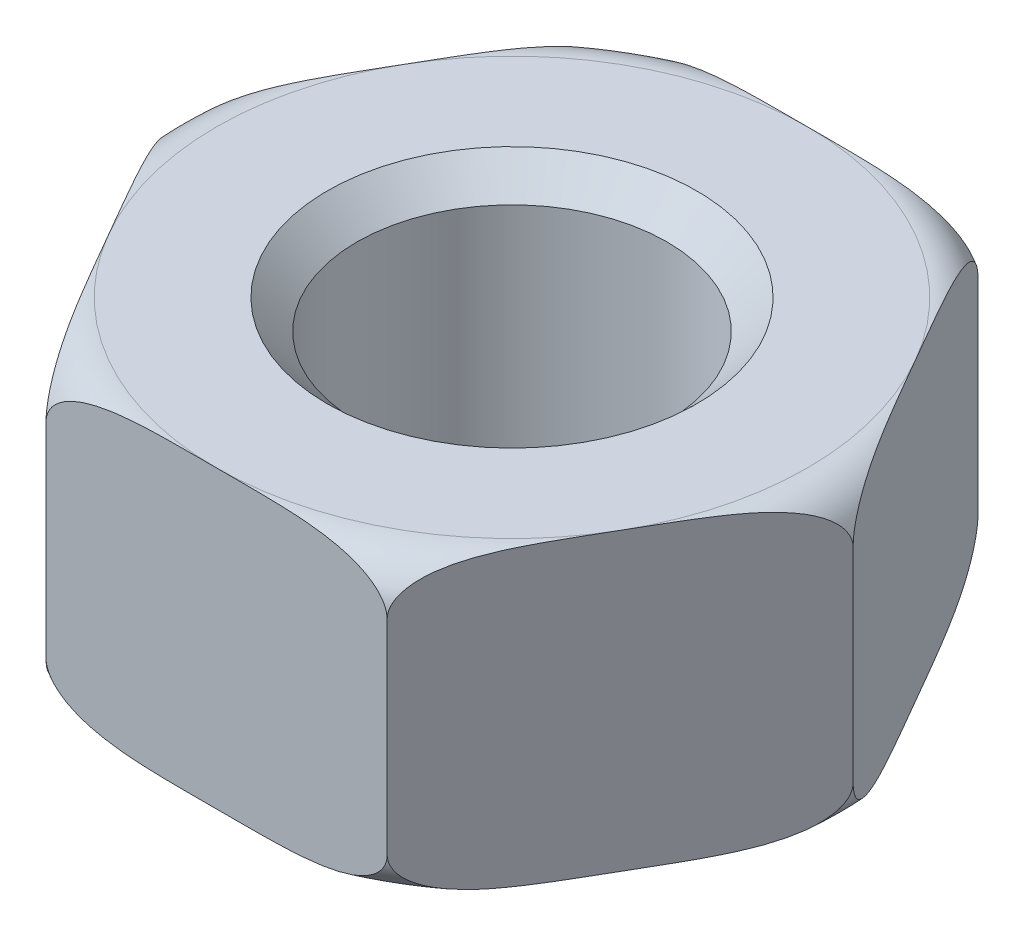
ISO-10303-21;
HEADER;
FILE_DESCRIPTION(('STEP AP214'),'2;1');
FILE_NAME('part.step','',(''),(''),'','','');
FILE_SCHEMA(('AUTOMOTIVE_DESIGN { 1 0 10303 214 1 1 1 1 }'));
ENDSEC;
DATA;
#1=APPLICATION_CONTEXT('core data for automotive mechanical design processes');
#2=APPLICATION_PROTOCOL_DEFINITION('international standard','automotive_design',2000,#1);
#3=PRODUCT_CONTEXT('',#1,'mechanical');
#4=PRODUCT('Part','Part','',(#3));
#5=PRODUCT_RELATED_PRODUCT_CATEGORY('part','',(#4));
#6=PRODUCT_DEFINITION_FORMATION('','',#4);
#7=PRODUCT_DEFINITION_CONTEXT('part definition',#1,'design');
#8=PRODUCT_DEFINITION('design','',#6,#7);
#9=PRODUCT_DEFINITION_SHAPE('','',#8);
#10=(LENGTH_UNIT() NAMED_UNIT(*) SI_UNIT(.MILLI.,.METRE.));
#11=(NAMED_UNIT(*) PLANE_ANGLE_UNIT() SI_UNIT($,.RADIAN.));
#12=(NAMED_UNIT(*) SI_UNIT($,.STERADIAN.) SOLID_ANGLE_UNIT());
#13=UNCERTAINTY_MEASURE_WITH_UNIT(LENGTH_MEASURE(1.E-05),#10,'distance_accuracy_value','');
#14=(GEOMETRIC_REPRESENTATION_CONTEXT(3) GLOBAL_UNCERTAINTY_ASSIGNED_CONTEXT((#13)) GLOBAL_UNIT_ASSIGNED_CONTEXT((#10,
#11,#12)) REPRESENTATION_CONTEXT('',''));
#15=CARTESIAN_POINT('',(0.,0.,0.));
#16=DIRECTION('',(0.,0.,1.));
#17=DIRECTION('',(1.,0.,0.));
#18=AXIS2_PLACEMENT_3D('',#15,#16,#17);
#19=CARTESIAN_POINT('',(0.,1.6,0.));
#20=DIRECTION('',(0.,1.,0.));
#21=DIRECTION('',(0.,0.,1.));
#22=AXIS2_PLACEMENT_3D('',#19,#20,#21);
#23=CONICAL_SURFACE('',#22,2.1,0.785398163397448);
#24=CARTESIAN_POINT('',(0.,1.6,0.));
#25=DIRECTION('',(0.,1.,0.));
#26=DIRECTION('',(0.,0.,1.));
#27=AXIS2_PLACEMENT_3D('',#24,#25,#26);
#28=CIRCLE('',#27,2.1);
#29=CARTESIAN_POINT('',(0.,1.6,2.1));
#30=VERTEX_POINT('',#29);
#31=EDGE_CURVE('E29',#30,#30,#28,.T.);
#32=ORIENTED_EDGE('',*,*,#31,.F.);
#33=EDGE_LOOP('',(#32));
#34=FACE_BOUND('',#33,.T.);
#35=CARTESIAN_POINT('',(0.,2.,0.));
#36=DIRECTION('',(0.,-1.,0.));
#37=DIRECTION('',(0.,0.,1.));
#38=AXIS2_PLACEMENT_3D('',#35,#36,#37);
#39=CIRCLE('',#38,2.5);
#40=CARTESIAN_POINT('',(0.,2.,2.5));
#41=VERTEX_POINT('',#40);
#42=EDGE_CURVE('E981',#41,#41,#39,.T.);
#43=ORIENTED_EDGE('',*,*,#42,.F.);
#44=EDGE_LOOP('',(#43));
#45=FACE_BOUND('',#44,.T.);
#46=ADVANCED_FACE('F15',(#34,#45),#23,.F.);
#47=CARTESIAN_POINT('',(0.,-2.,0.));
#48=DIRECTION('',(0.,-1.,0.));
#49=DIRECTION('',(0.,0.,-1.));
#50=AXIS2_PLACEMENT_3D('',#47,#48,#49);
#51=CONICAL_SURFACE('',#50,2.5,0.785398163397447);
#52=CARTESIAN_POINT('',(0.,-1.6,0.));
#53=DIRECTION('',(0.,-1.,0.));
#54=DIRECTION('',(0.,0.,1.));
#55=AXIS2_PLACEMENT_3D('',#52,#53,#54);
#56=CIRCLE('',#55,2.1);
#57=CARTESIAN_POINT('',(0.,-1.6,2.1));
#58=VERTEX_POINT('',#57);
#59=EDGE_CURVE('E10',#58,#58,#56,.T.);
#60=ORIENTED_EDGE('',*,*,#59,.F.);
#61=EDGE_LOOP('',(#60));
#62=FACE_BOUND('',#61,.T.);
#63=CARTESIAN_POINT('',(0.,-2.,0.));
#64=DIRECTION('',(0.,1.,0.));
#65=DIRECTION('',(0.,0.,1.));
#66=AXIS2_PLACEMENT_3D('',#63,#64,#65);
#67=CIRCLE('',#66,2.5);
#68=CARTESIAN_POINT('',(0.,-2.,2.5));
#69=VERTEX_POINT('',#68);
#70=EDGE_CURVE('E520',#69,#69,#67,.T.);
#71=ORIENTED_EDGE('',*,*,#70,.F.);
#72=EDGE_LOOP('',(#71));
#73=FACE_BOUND('',#72,.T.);
#74=ADVANCED_FACE('F678',(#62,#73),#51,.F.);
#75=CARTESIAN_POINT('',(0.,-2.16286824492314,0.));
#76=DIRECTION('',(0.,1.,0.));
#77=DIRECTION('',(0.,0.,1.));
#78=AXIS2_PLACEMENT_3D('',#75,#76,#77);
#79=CYLINDRICAL_SURFACE('',#78,2.1);
#80=ORIENTED_EDGE('',*,*,#59,.T.);
#81=EDGE_LOOP('',(#80));
#82=FACE_BOUND('',#81,.T.);
#83=ORIENTED_EDGE('',*,*,#31,.T.);
#84=EDGE_LOOP('',(#83));
#85=FACE_BOUND('',#84,.T.);
#86=ADVANCED_FACE('F667',(#82,#85),#79,.F.);
#87=CARTESIAN_POINT('',(0.,-2.,0.));
#88=DIRECTION('',(0.,1.,0.));
#89=DIRECTION('',(1.,0.,0.));
#90=AXIS2_PLACEMENT_3D('',#87,#88,#89);
#91=PLANE('',#90);
#92=ORIENTED_EDGE('',*,*,#70,.T.);
#93=EDGE_LOOP('',(#92));
#94=FACE_BOUND('',#93,.T.);
#95=CARTESIAN_POINT('',(0.,-2.,0.));
#96=DIRECTION('',(0.,1.,0.));
#97=DIRECTION('',(1.,0.,0.));
#98=AXIS2_PLACEMENT_3D('',#95,#96,#97);
#99=CIRCLE('',#98,4.);
#100=CARTESIAN_POINT('',(3.46410161513777,-2.,-2.));
#101=VERTEX_POINT('',#100);
#102=CARTESIAN_POINT('',(0.,-2.,-4.));
#103=VERTEX_POINT('',#102);
#104=EDGE_CURVE('E329',#101,#103,#99,.T.);
#105=ORIENTED_EDGE('',*,*,#104,.F.);
#106=CARTESIAN_POINT('',(0.,-2.,0.));
#107=DIRECTION('',(0.,1.,0.));
#108=DIRECTION('',(1.,0.,0.));
#109=AXIS2_PLACEMENT_3D('',#106,#107,#108);
#110=CIRCLE('',#109,4.);
#111=CARTESIAN_POINT('',(3.46410161513777,-2.,2.));
#112=VERTEX_POINT('',#111);
#113=EDGE_CURVE('E974',#112,#101,#110,.T.);
#114=ORIENTED_EDGE('',*,*,#113,.F.);
#115=CARTESIAN_POINT('',(0.,-2.,0.));
#116=DIRECTION('',(0.,1.,0.));
#117=DIRECTION('',(1.,0.,0.));
#118=AXIS2_PLACEMENT_3D('',#115,#116,#117);
#119=CIRCLE('',#118,4.);
#120=CARTESIAN_POINT('',(0.,-2.,4.));
#121=VERTEX_POINT('',#120);
#122=EDGE_CURVE('E79',#121,#112,#119,.T.);
#123=ORIENTED_EDGE('',*,*,#122,.F.);
#124=CARTESIAN_POINT('',(0.,-2.,0.));
#125=DIRECTION('',(0.,1.,0.));
#126=DIRECTION('',(-1.,0.,0.));
#127=AXIS2_PLACEMENT_3D('',#124,#125,#126);
#128=CIRCLE('',#127,4.);
#129=CARTESIAN_POINT('',(-3.46410161513774,-2.,2.));
#130=VERTEX_POINT('',#129);
#131=EDGE_CURVE('E271',#130,#121,#128,.T.);
#132=ORIENTED_EDGE('',*,*,#131,.F.);
#133=CARTESIAN_POINT('',(0.,-2.,0.));
#134=DIRECTION('',(0.,1.,0.));
#135=DIRECTION('',(1.,0.,0.));
#136=AXIS2_PLACEMENT_3D('',#133,#134,#135);
#137=CIRCLE('',#136,4.);
#138=CARTESIAN_POINT('',(-3.46410161513774,-2.,-2.));
#139=VERTEX_POINT('',#138);
#140=EDGE_CURVE('E374',#139,#130,#137,.T.);
#141=ORIENTED_EDGE('',*,*,#140,.F.);
#142=CARTESIAN_POINT('',(0.,-2.,0.));
#143=DIRECTION('',(0.,1.,0.));
#144=DIRECTION('',(1.,0.,0.));
#145=AXIS2_PLACEMENT_3D('',#142,#143,#144);
#146=CIRCLE('',#145,4.);
#147=EDGE_CURVE('E371',#103,#139,#146,.T.);
#148=ORIENTED_EDGE('',*,*,#147,.F.);
#149=EDGE_LOOP('',(#105,#114,#123,#132,#141,#148));
#150=FACE_BOUND('',#149,.T.);
#151=ADVANCED_FACE('F657',(#94,#150),#91,.F.);
#152=CARTESIAN_POINT('',(0.,-1.38119784648299,0.));
#153=DIRECTION('',(0.,-1.,0.));
#154=DIRECTION('',(-1.,0.,0.));
#155=AXIS2_PLACEMENT_3D('',#152,#153,#154);
#156=TOROIDAL_SURFACE('',#155,4.,0.618802153517015);
#157=ORIENTED_EDGE('',*,*,#104,.T.);
#158=CARTESIAN_POINT('',(2.30940107675853,-1.38119784648298,-4.));
#159=CARTESIAN_POINT('',(2.30940107675853,-1.53311042973439,-4.));
#160=CARTESIAN_POINT('',(2.17058493305778,-1.66286205167738,-4.));
#161=CARTESIAN_POINT('',(2.06734871184109,-1.75935707588009,-4.));
#162=CARTESIAN_POINT('',(1.89699346630574,-1.82903988159357,-4.));
#163=CARTESIAN_POINT('',(1.65387305202242,-1.92848684925366,-4.));
#164=CARTESIAN_POINT('',(1.27412688280946,-1.96745964180882,-4.));
#165=CARTESIAN_POINT('',(1.02594485791631,-1.99293019913433,-4.));
#166=CARTESIAN_POINT('',(0.63718117734921,-1.99794148266363,-4.));
#167=CARTESIAN_POINT('',(0.477486206685755,-2.,-4.));
#168=CARTESIAN_POINT('',(0.,-2.,-4.));
#169=B_SPLINE_CURVE_WITH_KNOTS('',2,(#158,#159,#160,#161,#162,#163,#164,#165,#166,#167,#168),
.UNSPECIFIED.,.F.,.F.,(3,2,2,2,2,3),(0.,0.125,0.25,0.5,0.75,1.),.UNSPECIFIED.);
#170=CARTESIAN_POINT('',(2.30940107675853,-1.38119784648298,-4.));
#171=VERTEX_POINT('',#170);
#172=EDGE_CURVE('E142',#171,#103,#169,.T.);
#173=ORIENTED_EDGE('',*,*,#172,.F.);
#174=CARTESIAN_POINT('',(3.46410161513776,-2.,-2.));
#175=CARTESIAN_POINT('',(3.22474695024369,-2.,-2.41457444062515));
#176=CARTESIAN_POINT('',(3.1442448478216,-1.99790871420006,-2.55400817213633));
#177=CARTESIAN_POINT('',(2.9497853741718,-1.99285704071983,-2.89082186051088));
#178=CARTESIAN_POINT('',(2.82491461005143,-1.96702199911714,-3.1071043683473));
#179=CARTESIAN_POINT('',(2.63605571126172,-1.92794818114508,-3.43421757651259));
#180=CARTESIAN_POINT('',(2.51435100373841,-1.82801221941492,-3.64501631346328));
#181=CARTESIAN_POINT('',(2.43008093731723,-1.75881514146909,-3.79097635006196));
#182=CARTESIAN_POINT('',(2.37830008499461,-1.66190994790941,-3.88066341714396));
#183=CARTESIAN_POINT('',(2.30940107675851,-1.53296900874546,-3.99999999999999));
#184=CARTESIAN_POINT('',(2.30940107675851,-1.38119784648298,-3.99999999999999));
#185=B_SPLINE_CURVE_WITH_KNOTS('',2,(#174,#175,#176,#177,#178,#179,#180,#181,#182,#183,#184),
.UNSPECIFIED.,.F.,.F.,(3,2,2,2,2,3),(0.,0.25,0.5,0.75,0.875,1.),.UNSPECIFIED.);
#186=EDGE_CURVE('E1193',#101,#171,#185,.T.);
#187=ORIENTED_EDGE('',*,*,#186,.F.);
#188=EDGE_LOOP('',(#157,#173,#187));
#189=FACE_BOUND('',#188,.T.);
#190=ADVANCED_FACE('F246',(#189),#156,.T.);
#191=CARTESIAN_POINT('',(0.,-1.38119784648299,0.));
#192=DIRECTION('',(0.,-1.,0.));
#193=DIRECTION('',(-1.,0.,0.));
#194=AXIS2_PLACEMENT_3D('',#191,#192,#193);
#195=TOROIDAL_SURFACE('',#194,4.,0.618802153517015);
#196=ORIENTED_EDGE('',*,*,#147,.T.);
#197=CARTESIAN_POINT('',(-2.3094010767585,-1.38119784648298,-4.00000000000002));
#198=CARTESIAN_POINT('',(-2.3094010767585,-1.45868796626602,-4.00000000000002));
#199=CARTESIAN_POINT('',(-2.32947067101236,-1.53563413097515,-3.96523844306502));
#200=CARTESIAN_POINT('',(-2.34731691692672,-1.60405605122902,-3.93432783841699));
#201=CARTESIAN_POINT('',(-2.37893859251022,-1.66310345008823,-3.87955748968592));
#202=CARTESIAN_POINT('',(-2.43055561551908,-1.75948831551009,-3.79015418329911));
#203=CARTESIAN_POINT('',(-2.51566950292517,-1.82909268029787,-3.64273260588206));
#204=CARTESIAN_POINT('',(-2.63693612038259,-1.92826199491058,-3.4326926631838));
#205=CARTESIAN_POINT('',(-2.8261115223567,-1.96726922171706,-3.10503125542238));
#206=CARTESIAN_POINT('',(-2.95027605576066,-1.99287146209963,-2.88997197506863));
#207=CARTESIAN_POINT('',(-3.14471756697839,-1.99792099334568,-2.55318939853906));
#208=CARTESIAN_POINT('',(-3.2247735515838,-2.,-2.41452836575253));
#209=CARTESIAN_POINT('',(-3.46410161513776,-2.,-2.));
#210=B_SPLINE_CURVE_WITH_KNOTS('',2,(#197,#198,#199,#200,#201,#202,#203,#204,#205,#206,#207,
#208,#209),.UNSPECIFIED.,.F.,.F.,(3,2,2,2,2,2,3),(0.,0.0625,0.125,0.25,0.5,0.75,1.),.UNSPECIFIED.);
#211=CARTESIAN_POINT('',(-2.30940107675849,-1.38119784648298,-4.));
#212=VERTEX_POINT('',#211);
#213=EDGE_CURVE('E356',#212,#139,#210,.T.);
#214=ORIENTED_EDGE('',*,*,#213,.F.);
#215=CARTESIAN_POINT('',(0.,-2.,-4.));
#216=CARTESIAN_POINT('',(-0.477678904070755,-2.,-4.));
#217=CARTESIAN_POINT('',(-0.6383440358329,-1.99792648340885,-4.));
#218=CARTESIAN_POINT('',(-1.02721740774398,-1.99290775047237,-4.));
#219=CARTESIAN_POINT('',(-1.27685049433859,-1.96717950580727,-4.));
#220=CARTESIAN_POINT('',(-1.6550587084658,-1.92819976317715,-4.));
#221=CARTESIAN_POINT('',(-1.89878095140311,-1.82830800187989,-4.));
#222=CARTESIAN_POINT('',(-2.06786482549243,-1.75900744979984,-4.));
#223=CARTESIAN_POINT('',(-2.17167839650144,-1.66183932160722,-4.));
#224=CARTESIAN_POINT('',(-2.30940107675849,-1.53293271604324,-4.));
#225=CARTESIAN_POINT('',(-2.30940107675849,-1.38119784648298,-4.));
#226=B_SPLINE_CURVE_WITH_KNOTS('',2,(#215,#216,#217,#218,#219,#220,#221,#222,#223,#224,#225),
.UNSPECIFIED.,.F.,.F.,(3,2,2,2,2,3),(0.,0.25,0.5,0.75,0.875,1.),.UNSPECIFIED.);
#227=EDGE_CURVE('E324',#103,#212,#226,.T.);
#228=ORIENTED_EDGE('',*,*,#227,.F.);
#229=EDGE_LOOP('',(#196,#214,#228));
#230=FACE_BOUND('',#229,.T.);
#231=ADVANCED_FACE('F331',(#230),#195,.T.);
#232=CARTESIAN_POINT('',(0.,-1.38119784648299,0.));
#233=DIRECTION('',(0.,-1.,0.));
#234=DIRECTION('',(-1.,0.,0.));
#235=AXIS2_PLACEMENT_3D('',#232,#233,#234);
#236=TOROIDAL_SURFACE('',#235,4.,0.618802153517015);
#237=ORIENTED_EDGE('',*,*,#140,.T.);
#238=CARTESIAN_POINT('',(-4.61880215351701,-1.38119784648298,0.));
#239=CARTESIAN_POINT('',(-4.61880215351701,-1.45868796626602,0.));
#240=CARTESIAN_POINT('',(-4.59873255926315,-1.53563413097515,0.0347615569349823));
#241=CARTESIAN_POINT('',(-4.58088631334883,-1.6040560512289,0.0656721615829534));
#242=CARTESIAN_POINT('',(-4.54926463776529,-1.66310345008823,0.12044251031409));
#243=CARTESIAN_POINT('',(-4.49764761475657,-1.75948831550994,0.209845816700658));
#244=CARTESIAN_POINT('',(-4.41253372735034,-1.82909268029787,0.357267394117946));
#245=CARTESIAN_POINT('',(-4.29126710989324,-1.92826199491038,0.567307336815651));
#246=CARTESIAN_POINT('',(-4.10209170791881,-1.96726922171706,0.894968744577634));
#247=CARTESIAN_POINT('',(-3.97792717451337,-1.99287146210003,1.11002802493394));
#248=CARTESIAN_POINT('',(-3.78348566329712,-1.99792099334568,1.44681060146095));
#249=CARTESIAN_POINT('',(-3.70342967868605,-2.,1.58547163425729));
#250=CARTESIAN_POINT('',(-3.46410161513775,-2.,2.00000000000001));
#251=B_SPLINE_CURVE_WITH_KNOTS('',2,(#238,#239,#240,#241,#242,#243,#244,#245,#246,#247,#248,
#249,#250),.UNSPECIFIED.,.F.,.F.,(3,2,2,2,2,2,3),(0.,0.0625,0.125,0.25,0.5,0.75,1.),.UNSPECIFIED.);
#252=CARTESIAN_POINT('',(-4.61880215351701,-1.38119784648298,0.));
#253=VERTEX_POINT('',#252);
#254=EDGE_CURVE('E547',#253,#130,#251,.T.);
#255=ORIENTED_EDGE('',*,*,#254,.F.);
#256=CARTESIAN_POINT('',(-3.46410161513776,-2.,-2.));
#257=CARTESIAN_POINT('',(-3.70345628002648,-2.,-1.58542555938411));
#258=CARTESIAN_POINT('',(-3.78395838245391,-1.99790871420006,-1.44599182786368));
#259=CARTESIAN_POINT('',(-3.97841785610165,-1.99285704072021,-1.1091781394927));
#260=CARTESIAN_POINT('',(-4.10328862022407,-1.96702199911713,-0.892895631652714));
#261=CARTESIAN_POINT('',(-4.29214751901397,-1.9279481811451,-0.565782423487107));
#262=CARTESIAN_POINT('',(-4.4138522265371,-1.82801221941491,-0.35498368653674));
#263=CARTESIAN_POINT('',(-4.49812229295831,-1.75881514146892,-0.209023649937987));
#264=CARTESIAN_POINT('',(-4.54990314528089,-1.66190994790941,-0.119336582856062));
#265=CARTESIAN_POINT('',(-4.61880215351701,-1.53296900874552,0.));
#266=CARTESIAN_POINT('',(-4.61880215351701,-1.38119784648298,0.));
#267=B_SPLINE_CURVE_WITH_KNOTS('',2,(#256,#257,#258,#259,#260,#261,#262,#263,#264,#265,#266),
.UNSPECIFIED.,.F.,.F.,(3,2,2,2,2,3),(0.,0.25,0.5,0.75,0.875,1.),.UNSPECIFIED.);
#268=EDGE_CURVE('E483',#139,#253,#267,.T.);
#269=ORIENTED_EDGE('',*,*,#268,.F.);
#270=EDGE_LOOP('',(#237,#255,#269));
#271=FACE_BOUND('',#270,.T.);
#272=ADVANCED_FACE('F340',(#271),#236,.T.);
#273=CARTESIAN_POINT('',(0.,-1.38119784648299,0.));
#274=DIRECTION('',(0.,-1.,0.));
#275=DIRECTION('',(-1.,0.,0.));
#276=AXIS2_PLACEMENT_3D('',#273,#274,#275);
#277=TOROIDAL_SURFACE('',#276,4.,0.618802153517015);
#278=ORIENTED_EDGE('',*,*,#131,.T.);
#279=CARTESIAN_POINT('',(-2.30940107675851,-1.38119784648298,4.));
#280=CARTESIAN_POINT('',(-2.30940107675851,-1.53311042973437,4.));
#281=CARTESIAN_POINT('',(-2.17058493305776,-1.66286205167738,4.));
#282=CARTESIAN_POINT('',(-2.06734871184101,-1.75935707588017,4.));
#283=CARTESIAN_POINT('',(-1.89699346630572,-1.82903988159357,4.));
#284=CARTESIAN_POINT('',(-1.65387305202271,-1.92848684925348,4.));
#285=CARTESIAN_POINT('',(-1.27412688280944,-1.96745964180882,4.));
#286=CARTESIAN_POINT('',(-1.02594485792075,-1.99293019913397,4.));
#287=CARTESIAN_POINT('',(-0.637181177349195,-1.99794148266363,4.));
#288=CARTESIAN_POINT('',(-0.47748620669513,-2.,4.));
#289=CARTESIAN_POINT('',(0.,-2.,4.));
#290=B_SPLINE_CURVE_WITH_KNOTS('',2,(#279,#280,#281,#282,#283,#284,#285,#286,#287,#288,#289),
.UNSPECIFIED.,.F.,.F.,(3,2,2,2,2,3),(0.,0.125,0.25,0.5,0.75,1.),.UNSPECIFIED.);
#291=CARTESIAN_POINT('',(-2.30940107675852,-1.38119784648298,4.));
#292=VERTEX_POINT('',#291);
#293=EDGE_CURVE('E1023',#292,#121,#290,.T.);
#294=ORIENTED_EDGE('',*,*,#293,.F.);
#295=CARTESIAN_POINT('',(-3.46410161513775,-2.,2.00000000000001));
#296=CARTESIAN_POINT('',(-3.22474695024857,-2.,2.41457444061669));
#297=CARTESIAN_POINT('',(-3.1442448478216,-1.99790871420006,2.55400817213633));
#298=CARTESIAN_POINT('',(-2.94978537417412,-1.99285704072019,2.89082186050686));
#299=CARTESIAN_POINT('',(-2.82491461005143,-1.96702199911713,3.1071043683473));
#300=CARTESIAN_POINT('',(-2.63605571126157,-1.92794818114522,3.43421757651285));
#301=CARTESIAN_POINT('',(-2.51435100373841,-1.82801221941491,3.64501631346327));
#302=CARTESIAN_POINT('',(-2.43008093731696,-1.75881514146866,3.79097635006244));
#303=CARTESIAN_POINT('',(-2.37830008499462,-1.66190994790941,3.88066341714395));
#304=CARTESIAN_POINT('',(-2.3094010767585,-1.53296900874529,4.));
#305=CARTESIAN_POINT('',(-2.3094010767585,-1.38119784648298,4.));
#306=B_SPLINE_CURVE_WITH_KNOTS('',2,(#295,#296,#297,#298,#299,#300,#301,#302,#303,#304,#305),
.UNSPECIFIED.,.F.,.F.,(3,2,2,2,2,3),(0.,0.25,0.5,0.75,0.875,1.),.UNSPECIFIED.);
#307=EDGE_CURVE('E1038',#130,#292,#306,.T.);
#308=ORIENTED_EDGE('',*,*,#307,.F.);
#309=EDGE_LOOP('',(#278,#294,#308));
#310=FACE_BOUND('',#309,.T.);
#311=ADVANCED_FACE('F284',(#310),#277,.T.);
#312=CARTESIAN_POINT('',(0.,-1.38119784648299,0.));
#313=DIRECTION('',(0.,-1.,0.));
#314=DIRECTION('',(-1.,0.,0.));
#315=AXIS2_PLACEMENT_3D('',#312,#313,#314);
#316=TOROIDAL_SURFACE('',#315,4.,0.618802153517015);
#317=CARTESIAN_POINT('',(0.,-2.,4.));
#318=CARTESIAN_POINT('',(0.477678904071215,-2.,4.));
#319=CARTESIAN_POINT('',(0.63834403583292,-1.99792648340885,4.));
#320=CARTESIAN_POINT('',(1.02721740774485,-1.99290775047235,4.));
#321=CARTESIAN_POINT('',(1.27685049433861,-1.96717950580727,4.));
#322=CARTESIAN_POINT('',(1.65505870846574,-1.92819976317706,4.));
#323=CARTESIAN_POINT('',(1.89878095140314,-1.82830800187989,4.));
#324=CARTESIAN_POINT('',(2.06786482549213,-1.75900744980005,4.));
#325=CARTESIAN_POINT('',(2.17167839650147,-1.66183932160722,4.));
#326=CARTESIAN_POINT('',(2.30940107675851,-1.53293271604337,4.));
#327=CARTESIAN_POINT('',(2.30940107675851,-1.38119784648298,4.));
#328=B_SPLINE_CURVE_WITH_KNOTS('',2,(#317,#318,#319,#320,#321,#322,#323,#324,#325,#326,#327),
.UNSPECIFIED.,.F.,.F.,(3,2,2,2,2,3),(0.,0.25,0.5,0.75,0.875,1.),.UNSPECIFIED.);
#329=CARTESIAN_POINT('',(2.30940107675851,-1.38119784648298,4.));
#330=VERTEX_POINT('',#329);
#331=EDGE_CURVE('E224',#121,#330,#328,.T.);
#332=ORIENTED_EDGE('',*,*,#331,.F.);
#333=ORIENTED_EDGE('',*,*,#122,.T.);
#334=CARTESIAN_POINT('',(2.30940107675851,-1.38119784648298,4.));
#335=CARTESIAN_POINT('',(2.30940107675851,-1.45868796626621,4.));
#336=CARTESIAN_POINT('',(2.32947067101236,-1.53563413097516,3.96523844306504));
#337=CARTESIAN_POINT('',(2.34731691692667,-1.60405605122875,3.93432783841708));
#338=CARTESIAN_POINT('',(2.37893859251021,-1.66310345008824,3.87955748968593));
#339=CARTESIAN_POINT('',(2.43055561551886,-1.75948831551005,3.79015418329949));
#340=CARTESIAN_POINT('',(2.51566950292517,-1.82909268029788,3.64273260588207));
#341=CARTESIAN_POINT('',(2.63693612038353,-1.92826199491119,3.43269266318217));
#342=CARTESIAN_POINT('',(2.8261115223567,-1.96726922171707,3.10503125542238));
#343=CARTESIAN_POINT('',(2.95027605576241,-1.99287146209973,2.8899719750656));
#344=CARTESIAN_POINT('',(3.14471756697839,-1.99792099334568,2.55318939853906));
#345=CARTESIAN_POINT('',(3.22477355158443,-2.,2.41452836575143));
#346=CARTESIAN_POINT('',(3.46410161513776,-2.,2.));
#347=B_SPLINE_CURVE_WITH_KNOTS('',2,(#334,#335,#336,#337,#338,#339,#340,#341,#342,#343,#344,
#345,#346),.UNSPECIFIED.,.F.,.F.,(3,2,2,2,2,2,3),(0.,0.0625,0.125,0.25,0.5,0.75,1.),.UNSPECIFIED.);
#348=EDGE_CURVE('E1063',#330,#112,#347,.T.);
#349=ORIENTED_EDGE('',*,*,#348,.F.);
#350=EDGE_LOOP('',(#332,#333,#349));
#351=FACE_BOUND('',#350,.T.);
#352=ADVANCED_FACE('F273',(#351),#316,.T.);
#353=CARTESIAN_POINT('',(0.,-1.38119784648299,0.));
#354=DIRECTION('',(0.,-1.,0.));
#355=DIRECTION('',(-1.,0.,0.));
#356=AXIS2_PLACEMENT_3D('',#353,#354,#355);
#357=TOROIDAL_SURFACE('',#356,4.,0.618802153517015);
#358=ORIENTED_EDGE('',*,*,#113,.T.);
#359=CARTESIAN_POINT('',(4.61880215351702,-1.38119784648298,0.));
#360=CARTESIAN_POINT('',(4.61880215351702,-1.45868796626622,0.));
#361=CARTESIAN_POINT('',(4.59873255926316,-1.53563413097515,-0.0347615569349568));
#362=CARTESIAN_POINT('',(4.5808863133487,-1.60405605122927,-0.0656721615831673));
#363=CARTESIAN_POINT('',(4.54926463776531,-1.66310345008823,-0.120442510314065));
#364=CARTESIAN_POINT('',(4.4976476147563,-1.75948831551029,-0.209845816701126));
#365=CARTESIAN_POINT('',(4.41253372735035,-1.82909268029787,-0.357267394117923));
#366=CARTESIAN_POINT('',(4.29126710989328,-1.92826199491021,-0.567307336815595));
#367=CARTESIAN_POINT('',(4.10209170791882,-1.96726922171707,-0.894968744577619));
#368=CARTESIAN_POINT('',(3.97792717451599,-1.99287146209961,-1.1100280249294));
#369=CARTESIAN_POINT('',(3.78348566329713,-1.99792099334568,-1.44681060146094));
#370=CARTESIAN_POINT('',(3.70342967869177,-2.,-1.58547163424738));
#371=CARTESIAN_POINT('',(3.46410161513776,-2.,-2.));
#372=B_SPLINE_CURVE_WITH_KNOTS('',2,(#359,#360,#361,#362,#363,#364,#365,#366,#367,#368,#369,
#370,#371),.UNSPECIFIED.,.F.,.F.,(3,2,2,2,2,2,3),(0.,0.0625,0.125,0.25,0.5,0.75,1.),.UNSPECIFIED.);
#373=CARTESIAN_POINT('',(4.61880215351702,-1.38119784648298,0.));
#374=VERTEX_POINT('',#373);
#375=EDGE_CURVE('E92',#374,#101,#372,.T.);
#376=ORIENTED_EDGE('',*,*,#375,.F.);
#377=CARTESIAN_POINT('',(3.46410161513776,-2.,2.));
#378=CARTESIAN_POINT('',(3.70345628003179,-2.,1.58542555937491));
#379=CARTESIAN_POINT('',(3.78395838245392,-1.99790871420006,1.44599182786367));
#380=CARTESIAN_POINT('',(3.9784178561036,-1.99285704071984,1.10917813948933));
#381=CARTESIAN_POINT('',(4.10328862022408,-1.96702199911714,0.892895631652696));
#382=CARTESIAN_POINT('',(4.29214751901405,-1.92794818114506,0.56578242348696));
#383=CARTESIAN_POINT('',(4.41385222653711,-1.82801221941492,0.354983686536713));
#384=CARTESIAN_POINT('',(4.49812229295852,-1.75881514146876,0.209023649937632));
#385=CARTESIAN_POINT('',(4.5499031452809,-1.66190994790942,0.119336582856036));
#386=CARTESIAN_POINT('',(4.61880215351701,-1.53296900874531,0.));
#387=CARTESIAN_POINT('',(4.61880215351701,-1.38119784648298,0.));
#388=B_SPLINE_CURVE_WITH_KNOTS('',2,(#377,#378,#379,#380,#381,#382,#383,#384,#385,#386,#387),
.UNSPECIFIED.,.F.,.F.,(3,2,2,2,2,3),(0.,0.25,0.5,0.75,0.875,1.),.UNSPECIFIED.);
#389=EDGE_CURVE('E1067',#112,#374,#388,.T.);
#390=ORIENTED_EDGE('',*,*,#389,.F.);
#391=EDGE_LOOP('',(#358,#376,#390));
#392=FACE_BOUND('',#391,.T.);
#393=ADVANCED_FACE('F283',(#392),#357,.T.);
#394=CARTESIAN_POINT('',(0.,2.,0.));
#395=DIRECTION('',(0.,1.,0.));
#396=DIRECTION('',(1.,0.,0.));
#397=AXIS2_PLACEMENT_3D('',#394,#395,#396);
#398=PLANE('',#397);
#399=ORIENTED_EDGE('',*,*,#42,.T.);
#400=EDGE_LOOP('',(#399));
#401=FACE_BOUND('',#400,.T.);
#402=CARTESIAN_POINT('',(0.,2.,0.));
#403=DIRECTION('',(0.,-1.,0.));
#404=DIRECTION('',(-1.,0.,0.));
#405=AXIS2_PLACEMENT_3D('',#402,#403,#404);
#406=CIRCLE('',#405,4.);
#407=CARTESIAN_POINT('',(-3.46410161513774,2.,-2.));
#408=VERTEX_POINT('',#407);
#409=CARTESIAN_POINT('',(0.,2.,-4.));
#410=VERTEX_POINT('',#409);
#411=EDGE_CURVE('E424',#408,#410,#406,.T.);
#412=ORIENTED_EDGE('',*,*,#411,.F.);
#413=CARTESIAN_POINT('',(0.,2.,0.));
#414=DIRECTION('',(0.,-1.,0.));
#415=DIRECTION('',(-1.,0.,0.));
#416=AXIS2_PLACEMENT_3D('',#413,#414,#415);
#417=CIRCLE('',#416,4.);
#418=CARTESIAN_POINT('',(-3.46410161513774,2.,2.));
#419=VERTEX_POINT('',#418);
#420=EDGE_CURVE('E199',#419,#408,#417,.T.);
#421=ORIENTED_EDGE('',*,*,#420,.F.);
#422=CARTESIAN_POINT('',(0.,2.,0.));
#423=DIRECTION('',(0.,1.,0.));
#424=DIRECTION('',(-1.,0.,0.));
#425=AXIS2_PLACEMENT_3D('',#422,#423,#424);
#426=CIRCLE('',#425,4.);
#427=CARTESIAN_POINT('',(0.,2.,4.));
#428=VERTEX_POINT('',#427);
#429=EDGE_CURVE('E192',#419,#428,#426,.T.);
#430=ORIENTED_EDGE('',*,*,#429,.T.);
#431=CARTESIAN_POINT('',(0.,2.,0.));
#432=DIRECTION('',(0.,-1.,0.));
#433=DIRECTION('',(-1.,0.,0.));
#434=AXIS2_PLACEMENT_3D('',#431,#432,#433);
#435=CIRCLE('',#434,4.);
#436=CARTESIAN_POINT('',(3.46410161513777,2.,2.));
#437=VERTEX_POINT('',#436);
#438=EDGE_CURVE('E178',#437,#428,#435,.T.);
#439=ORIENTED_EDGE('',*,*,#438,.F.);
#440=CARTESIAN_POINT('',(0.,2.,0.));
#441=DIRECTION('',(0.,-1.,0.));
#442=DIRECTION('',(-1.,0.,0.));
#443=AXIS2_PLACEMENT_3D('',#440,#441,#442);
#444=CIRCLE('',#443,4.);
#445=CARTESIAN_POINT('',(3.46410161513777,2.,-2.));
#446=VERTEX_POINT('',#445);
#447=EDGE_CURVE('E191',#446,#437,#444,.T.);
#448=ORIENTED_EDGE('',*,*,#447,.F.);
#449=CARTESIAN_POINT('',(0.,2.,0.));
#450=DIRECTION('',(0.,-1.,0.));
#451=DIRECTION('',(-1.,0.,0.));
#452=AXIS2_PLACEMENT_3D('',#449,#450,#451);
#453=CIRCLE('',#452,4.);
#454=EDGE_CURVE('E994',#410,#446,#453,.T.);
#455=ORIENTED_EDGE('',*,*,#454,.F.);
#456=EDGE_LOOP('',(#412,#421,#430,#439,#448,#455));
#457=FACE_BOUND('',#456,.T.);
#458=ADVANCED_FACE('F197',(#401,#457),#398,.T.);
#459=CARTESIAN_POINT('',(0.,1.38119784648299,0.));
#460=DIRECTION('',(0.,1.,0.));
#461=DIRECTION('',(-1.,0.,0.));
#462=AXIS2_PLACEMENT_3D('',#459,#460,#461);
#463=TOROIDAL_SURFACE('',#462,4.,0.618802153517015);
#464=CARTESIAN_POINT('',(-3.46410161513776,2.,-2.));
#465=CARTESIAN_POINT('',(-3.22474695024613,2.,-2.41457444062091));
#466=CARTESIAN_POINT('',(-3.1442448478216,1.99790871420006,-2.55400817213633));
#467=CARTESIAN_POINT('',(-2.94978537417282,1.99285704072001,-2.89082186050911));
#468=CARTESIAN_POINT('',(-2.82491461005144,1.96702199911713,-3.1071043683473));
#469=CARTESIAN_POINT('',(-2.63605571126129,1.92794818114503,-3.43421757651333));
#470=CARTESIAN_POINT('',(-2.51435100373841,1.82801221941491,-3.64501631346327));
#471=CARTESIAN_POINT('',(-2.43008093731698,1.75881514146864,-3.7909763500624));
#472=CARTESIAN_POINT('',(-2.37830008499462,1.66190994790941,-3.88066341714394));
#473=CARTESIAN_POINT('',(-2.3094010767585,1.53296900874533,-4.00000000000002));
#474=CARTESIAN_POINT('',(-2.3094010767585,1.38119784648298,-4.00000000000002));
#475=B_SPLINE_CURVE_WITH_KNOTS('',2,(#464,#465,#466,#467,#468,#469,#470,#471,#472,#473,#474),
.UNSPECIFIED.,.F.,.F.,(3,2,2,2,2,3),(0.,0.25,0.5,0.75,0.875,1.),.UNSPECIFIED.);
#476=CARTESIAN_POINT('',(-2.30940107675849,1.38119784648298,-4.));
#477=VERTEX_POINT('',#476);
#478=EDGE_CURVE('E407',#408,#477,#475,.T.);
#479=ORIENTED_EDGE('',*,*,#478,.F.);
#480=ORIENTED_EDGE('',*,*,#411,.T.);
#481=CARTESIAN_POINT('',(-2.30940107675849,1.38119784648298,-4.));
#482=CARTESIAN_POINT('',(-2.30940107675849,1.46067625060879,-4.));
#483=CARTESIAN_POINT('',(-2.26920890416117,1.53711257413932,-4.));
#484=CARTESIAN_POINT('',(-2.23418775733458,1.60371478885578,-4.));
#485=CARTESIAN_POINT('',(-2.16947093797227,1.66389878434348,-4.));
#486=CARTESIAN_POINT('',(-2.06573248746548,1.7603713010512,-4.));
#487=CARTESIAN_POINT('',(-1.89482657979981,1.82992300056475,-4.));
#488=CARTESIAN_POINT('',(-1.65157889585837,1.92891483795612,-4.));
#489=CARTESIAN_POINT('',(-1.27202261885834,1.96767481434707,-4.));
#490=CARTESIAN_POINT('',(-1.02454371723717,1.99294715725208,-4.));
#491=CARTESIAN_POINT('',(-0.637242084081795,1.99794069907041,-4.));
#492=CARTESIAN_POINT('',(-0.47752166074173,2.,-4.));
#493=CARTESIAN_POINT('',(0.,2.,-4.));
#494=B_SPLINE_CURVE_WITH_KNOTS('',2,(#481,#482,#483,#484,#485,#486,#487,#488,#489,#490,#491,
#492,#493),.UNSPECIFIED.,.F.,.F.,(3,2,2,2,2,2,3),(0.,0.0625,0.125,0.25,0.5,0.75,1.),.UNSPECIFIED.);
#495=EDGE_CURVE('E446',#477,#410,#494,.T.);
#496=ORIENTED_EDGE('',*,*,#495,.F.);
#497=EDGE_LOOP('',(#479,#480,#496));
#498=FACE_BOUND('',#497,.T.);
#499=ADVANCED_FACE('F426',(#498),#463,.T.);
#500=CARTESIAN_POINT('',(0.,1.38119784648299,0.));
#501=DIRECTION('',(0.,1.,0.));
#502=DIRECTION('',(-1.,0.,0.));
#503=AXIS2_PLACEMENT_3D('',#500,#501,#502);
#504=TOROIDAL_SURFACE('',#503,4.,0.618802153517015);
#505=ORIENTED_EDGE('',*,*,#454,.T.);
#506=CARTESIAN_POINT('',(2.30940107675851,1.38119784648298,-3.99999999999999));
#507=CARTESIAN_POINT('',(2.30940107675851,1.45868796626597,-3.99999999999999));
#508=CARTESIAN_POINT('',(2.32947067101236,1.53563413097516,-3.96523844306504));
#509=CARTESIAN_POINT('',(2.34731691692664,1.60405605122886,-3.93432783841714));
#510=CARTESIAN_POINT('',(2.37893859251021,1.66310345008824,-3.87955748968593));
#511=CARTESIAN_POINT('',(2.43055561551902,1.75948831551005,-3.79015418329922));
#512=CARTESIAN_POINT('',(2.51566950292517,1.82909268029788,-3.64273260588207));
#513=CARTESIAN_POINT('',(2.63693612038245,1.92826199491048,-3.43269266318404));
#514=CARTESIAN_POINT('',(2.8261115223567,1.96726922171707,-3.10503125542238));
#515=CARTESIAN_POINT('',(2.95027605576145,1.99287146209985,-2.88997197506726));
#516=CARTESIAN_POINT('',(3.14471756697839,1.99792099334568,-2.55318939853906));
#517=CARTESIAN_POINT('',(3.22477355158683,2.,-2.41452836574728));
#518=CARTESIAN_POINT('',(3.46410161513776,2.,-2.));
#519=B_SPLINE_CURVE_WITH_KNOTS('',2,(#506,#507,#508,#509,#510,#511,#512,#513,#514,#515,#516,
#517,#518),.UNSPECIFIED.,.F.,.F.,(3,2,2,2,2,2,3),(0.,0.0625,0.125,0.25,0.5,0.75,1.),.UNSPECIFIED.);
#520=CARTESIAN_POINT('',(2.30940107675853,1.38119784648298,-4.));
#521=VERTEX_POINT('',#520);
#522=EDGE_CURVE('E1157',#521,#446,#519,.T.);
#523=ORIENTED_EDGE('',*,*,#522,.F.);
#524=CARTESIAN_POINT('',(0.,2.,-4.));
#525=CARTESIAN_POINT('',(0.478291346600645,2.,-4.));
#526=CARTESIAN_POINT('',(0.639143921491635,1.99791611868216,-4.));
#527=CARTESIAN_POINT('',(0.824195925638358,1.99551872831068,-4.));
#528=CARTESIAN_POINT('',(0.958665301580538,1.98969900777206,-4.));
#529=CARTESIAN_POINT('',(1.13097297165321,1.98224167795656,-4.));
#530=CARTESIAN_POINT('',(1.27758240853923,1.96710391014279,-4.));
#531=CARTESIAN_POINT('',(1.65553586900209,1.92807932993553,-4.));
#532=CARTESIAN_POINT('',(1.89911261454232,1.82817186522955,-4.));
#533=CARTESIAN_POINT('',(2.0677913056665,1.75898520973516,-4.));
#534=CARTESIAN_POINT('',(2.17144887987292,1.66205441357231,-4.));
#535=CARTESIAN_POINT('',(2.2347375418158,1.60287282035859,-4.));
#536=CARTESIAN_POINT('',(2.26994522668959,1.53571021551015,-4.));
#537=CARTESIAN_POINT('',(2.30940107675853,1.46044375943278,-4.));
#538=CARTESIAN_POINT('',(2.30940107675853,1.38119784648298,-4.));
#539=B_SPLINE_CURVE_WITH_KNOTS('',2,(#524,#525,#526,#527,#528,#529,#530,#531,#532,#533,#534,
#535,#536,#537,#538),.UNSPECIFIED.,.F.,.F.,(3,2,2,2,2,2,2,3),(0.,0.25,0.375,0.5,0.75,0.875,
0.9375,1.),.UNSPECIFIED.);
#540=EDGE_CURVE('E124',#410,#521,#539,.T.);
#541=ORIENTED_EDGE('',*,*,#540,.F.);
#542=EDGE_LOOP('',(#505,#523,#541));
#543=FACE_BOUND('',#542,.T.);
#544=ADVANCED_FACE('F435',(#543),#504,.T.);
#545=CARTESIAN_POINT('',(0.,1.38119784648299,0.));
#546=DIRECTION('',(0.,1.,0.));
#547=DIRECTION('',(-1.,0.,0.));
#548=AXIS2_PLACEMENT_3D('',#545,#546,#547);
#549=TOROIDAL_SURFACE('',#548,4.,0.618802153517015);
#550=ORIENTED_EDGE('',*,*,#447,.T.);
#551=CARTESIAN_POINT('',(4.61880215351701,1.38119784648298,0.));
#552=CARTESIAN_POINT('',(4.61880215351701,1.45868796626627,0.));
#553=CARTESIAN_POINT('',(4.59873255926316,1.53563413097515,0.034761556934956));
#554=CARTESIAN_POINT('',(4.58088631334875,1.60405605122908,0.065672161583083));
#555=CARTESIAN_POINT('',(4.54926463776531,1.66310345008823,0.120442510314062));
#556=CARTESIAN_POINT('',(4.49764761475653,1.75948831551002,0.209845816700715));
#557=CARTESIAN_POINT('',(4.41253372735035,1.82909268029787,0.35726739411792));
#558=CARTESIAN_POINT('',(4.29126710989255,1.9282619949109,0.567307336816844));
#559=CARTESIAN_POINT('',(4.10209170791882,1.96726922171707,0.894968744577615));
#560=CARTESIAN_POINT('',(3.97792717451313,1.99287146209983,1.11002802493435));
#561=CARTESIAN_POINT('',(3.78348566329713,1.99792099334568,1.44681060146094));
#562=CARTESIAN_POINT('',(3.70342967868935,2.,1.58547163425156));
#563=CARTESIAN_POINT('',(3.46410161513776,2.,2.));
#564=B_SPLINE_CURVE_WITH_KNOTS('',2,(#551,#552,#553,#554,#555,#556,#557,#558,#559,#560,#561,
#562,#563),.UNSPECIFIED.,.F.,.F.,(3,2,2,2,2,2,3),(0.,0.0625,0.125,0.25,0.5,0.75,1.),.UNSPECIFIED.);
#565=CARTESIAN_POINT('',(4.61880215351702,1.38119784648298,0.));
#566=VERTEX_POINT('',#565);
#567=EDGE_CURVE('E1091',#566,#437,#564,.T.);
#568=ORIENTED_EDGE('',*,*,#567,.F.);
#569=CARTESIAN_POINT('',(3.46410161513776,2.,-2.));
#570=CARTESIAN_POINT('',(3.70345628002927,2.,-1.58542555937928));
#571=CARTESIAN_POINT('',(3.78395838245392,1.99790871420006,-1.44599182786367));
#572=CARTESIAN_POINT('',(3.97841785610225,1.99285704072003,-1.10917813949166));
#573=CARTESIAN_POINT('',(4.10328862022408,1.96702199911714,-0.892895631652698));
#574=CARTESIAN_POINT('',(4.29214751901412,1.92794818114517,-0.565782423486846));
#575=CARTESIAN_POINT('',(4.41385222653711,1.82801221941491,-0.354983686536719));
#576=CARTESIAN_POINT('',(4.49812229295864,1.75881514146855,-0.209023649937427));
#577=CARTESIAN_POINT('',(4.54990314528091,1.66190994790941,-0.119336582856038));
#578=CARTESIAN_POINT('',(4.61880215351702,1.53296900874527,0.));
#579=CARTESIAN_POINT('',(4.61880215351702,1.38119784648298,0.));
#580=B_SPLINE_CURVE_WITH_KNOTS('',2,(#569,#570,#571,#572,#573,#574,#575,#576,#577,#578,#579),
.UNSPECIFIED.,.F.,.F.,(3,2,2,2,2,3),(0.,0.25,0.5,0.75,0.875,1.),.UNSPECIFIED.);
#581=EDGE_CURVE('E1015',#446,#566,#580,.T.);
#582=ORIENTED_EDGE('',*,*,#581,.F.);
#583=EDGE_LOOP('',(#550,#568,#582));
#584=FACE_BOUND('',#583,.T.);
#585=ADVANCED_FACE('F638',(#584),#549,.T.);
#586=CARTESIAN_POINT('',(0.,1.38119784648299,0.));
#587=DIRECTION('',(0.,1.,0.));
#588=DIRECTION('',(-1.,0.,0.));
#589=AXIS2_PLACEMENT_3D('',#586,#587,#588);
#590=TOROIDAL_SURFACE('',#589,4.,0.618802153517015);
#591=ORIENTED_EDGE('',*,*,#438,.T.);
#592=CARTESIAN_POINT('',(2.30940107675853,1.38119784648298,4.));
#593=CARTESIAN_POINT('',(2.30940107675853,1.46067625063078,4.));
#594=CARTESIAN_POINT('',(2.26920890413937,1.53711257418068,4.));
#595=CARTESIAN_POINT('',(2.23418775729554,1.60371478891061,4.));
#596=CARTESIAN_POINT('',(2.16947093790393,1.66389878440693,4.));
#597=CARTESIAN_POINT('',(2.06573248735462,1.76037130112434,4.));
#598=CARTESIAN_POINT('',(1.89482657962758,1.82992300063477,4.));
#599=CARTESIAN_POINT('',(1.65157889561461,1.92891483801526,4.));
#600=CARTESIAN_POINT('',(1.27202261849287,1.96767481438435,4.));
#601=CARTESIAN_POINT('',(1.02454371684095,1.99294715727014,4.));
#602=CARTESIAN_POINT('',(0.637242083529145,1.99794069907752,4.));
#603=CARTESIAN_POINT('',(0.477455273650344,2.00000085593401,4.));
#604=CARTESIAN_POINT('',(0.,2.,4.));
#605=B_SPLINE_CURVE_WITH_KNOTS('',2,(#592,#593,#594,#595,#596,#597,#598,#599,#600,#601,#602,
#603,#604),.UNSPECIFIED.,.F.,.F.,(3,2,2,2,2,2,3),(0.,0.0625,0.125,0.25,0.5,0.75,1.),.UNSPECIFIED.);
#606=CARTESIAN_POINT('',(2.30940107675853,1.38119784648298,4.));
#607=VERTEX_POINT('',#606);
#608=EDGE_CURVE('E182',#607,#428,#605,.T.);
#609=ORIENTED_EDGE('',*,*,#608,.F.);
#610=CARTESIAN_POINT('',(3.46410161513776,2.,2.));
#611=CARTESIAN_POINT('',(3.22474695024602,2.,2.41457444062111));
#612=CARTESIAN_POINT('',(3.1442448478216,1.99790871420006,2.55400817213632));
#613=CARTESIAN_POINT('',(2.94978537417288,1.99285704072001,2.89082186050901));
#614=CARTESIAN_POINT('',(2.82491461005143,1.96702199911714,3.1071043683473));
#615=CARTESIAN_POINT('',(2.63605571126131,1.92794818114506,3.43421757651329));
#616=CARTESIAN_POINT('',(2.51435100373841,1.82801221941491,3.64501631346328));
#617=CARTESIAN_POINT('',(2.43008093731709,1.75881514146875,3.7909763500622));
#618=CARTESIAN_POINT('',(2.37830008499461,1.66190994790941,3.88066341714396));
#619=CARTESIAN_POINT('',(2.30940107675851,1.53296900874557,3.99999999999999));
#620=CARTESIAN_POINT('',(2.30940107675851,1.38119784648298,3.99999999999999));
#621=B_SPLINE_CURVE_WITH_KNOTS('',2,(#610,#611,#612,#613,#614,#615,#616,#617,#618,#619,#620),
.UNSPECIFIED.,.F.,.F.,(3,2,2,2,2,3),(0.,0.25,0.5,0.75,0.875,1.),.UNSPECIFIED.);
#622=EDGE_CURVE('E185',#437,#607,#621,.T.);
#623=ORIENTED_EDGE('',*,*,#622,.F.);
#624=EDGE_LOOP('',(#591,#609,#623));
#625=FACE_BOUND('',#624,.T.);
#626=ADVANCED_FACE('F180',(#625),#590,.T.);
#627=CARTESIAN_POINT('',(0.,1.38119784648299,0.));
#628=DIRECTION('',(0.,1.,0.));
#629=DIRECTION('',(-1.,0.,0.));
#630=AXIS2_PLACEMENT_3D('',#627,#628,#629);
#631=TOROIDAL_SURFACE('',#630,4.,0.618802153517015);
#632=CARTESIAN_POINT('',(0.,2.,4.));
#633=CARTESIAN_POINT('',(-0.478257889695775,2.00000043370379,4.));
#634=CARTESIAN_POINT('',(-0.63914392371894,1.99791611865324,4.));
#635=CARTESIAN_POINT('',(-0.824195937637084,1.99551872785368,4.));
#636=CARTESIAN_POINT('',(-0.958665305966474,1.98969900756327,4.));
#637=CARTESIAN_POINT('',(-1.13097297644189,1.98224167762622,4.));
#638=CARTESIAN_POINT('',(-1.27758241304179,1.96710390967733,4.));
#639=CARTESIAN_POINT('',(-1.6555358719887,1.9280793292021,4.));
#640=CARTESIAN_POINT('',(-1.89911261664054,1.82817186436797,4.));
#641=CARTESIAN_POINT('',(-2.06779130701296,1.75898520884082,4.));
#642=CARTESIAN_POINT('',(-2.17144888070328,1.66205441279452,4.));
#643=CARTESIAN_POINT('',(-2.23473754228897,1.60287281969132,4.));
#644=CARTESIAN_POINT('',(-2.26994522695092,1.53571021500994,4.));
#645=CARTESIAN_POINT('',(-2.3094010767585,1.46044375916546,4.));
#646=CARTESIAN_POINT('',(-2.3094010767585,1.38119784648298,4.));
#647=B_SPLINE_CURVE_WITH_KNOTS('',2,(#632,#633,#634,#635,#636,#637,#638,#639,#640,#641,#642,
#643,#644,#645,#646),.UNSPECIFIED.,.F.,.F.,(3,2,2,2,2,2,2,3),(0.,0.25,0.375,0.5,0.75,0.875,
0.9375,1.),.UNSPECIFIED.);
#648=CARTESIAN_POINT('',(-2.3094010767585,1.38119784648298,4.));
#649=VERTEX_POINT('',#648);
#650=EDGE_CURVE('E205',#428,#649,#647,.T.);
#651=ORIENTED_EDGE('',*,*,#650,.F.);
#652=ORIENTED_EDGE('',*,*,#429,.F.);
#653=CARTESIAN_POINT('',(-2.3094010767585,1.38119784648298,4.));
#654=CARTESIAN_POINT('',(-2.3094010767585,1.45868796626635,4.));
#655=CARTESIAN_POINT('',(-2.32947067101236,1.53563413097515,3.96523844306502));
#656=CARTESIAN_POINT('',(-2.34731691692681,1.60405605122914,3.93432783841683));
#657=CARTESIAN_POINT('',(-2.37893859251021,1.66310345008823,3.87955748968592));
#658=CARTESIAN_POINT('',(-2.43055561551897,1.75948831551,3.79015418329931));
#659=CARTESIAN_POINT('',(-2.51566950292517,1.82909268029787,3.64273260588207));
#660=CARTESIAN_POINT('',(-2.63693612038286,1.9282619949108,3.43269266318334));
#661=CARTESIAN_POINT('',(-2.8261115223567,1.96726922171707,3.10503125542237));
#662=CARTESIAN_POINT('',(-2.95027605576036,1.99287146209946,2.88997197506916));
#663=CARTESIAN_POINT('',(-3.14471756697839,1.99792099334568,2.55318939853906));
#664=CARTESIAN_POINT('',(-3.22477355158121,2.,2.41452836575701));
#665=CARTESIAN_POINT('',(-3.46410161513775,2.,2.00000000000001));
#666=B_SPLINE_CURVE_WITH_KNOTS('',2,(#653,#654,#655,#656,#657,#658,#659,#660,#661,#662,#663,
#664,#665),.UNSPECIFIED.,.F.,.F.,(3,2,2,2,2,2,3),(0.,0.0625,0.125,0.25,0.5,0.75,1.),.UNSPECIFIED.);
#667=EDGE_CURVE('E209',#649,#419,#666,.T.);
#668=ORIENTED_EDGE('',*,*,#667,.F.);
#669=EDGE_LOOP('',(#651,#652,#668));
#670=FACE_BOUND('',#669,.T.);
#671=ADVANCED_FACE('F207',(#670),#631,.T.);
#672=CARTESIAN_POINT('',(0.,1.38119784648299,0.));
#673=DIRECTION('',(0.,1.,0.));
#674=DIRECTION('',(-1.,0.,0.));
#675=AXIS2_PLACEMENT_3D('',#672,#673,#674);
#676=TOROIDAL_SURFACE('',#675,4.,0.618802153517015);
#677=CARTESIAN_POINT('',(-3.46410161513775,2.,2.00000000000001));
#678=CARTESIAN_POINT('',(-3.70345628002669,2.,1.58542555938374));
#679=CARTESIAN_POINT('',(-3.78395838245391,1.99790871420006,1.44599182786368));
#680=CARTESIAN_POINT('',(-3.97841785610136,1.99285704072021,1.10917813949321));
#681=CARTESIAN_POINT('',(-4.10328862022407,1.96702199911713,0.892895631652714));
#682=CARTESIAN_POINT('',(-4.29214751901402,1.92794818114518,0.565782423487025));
#683=CARTESIAN_POINT('',(-4.4138522265371,1.82801221941491,0.354983686536743));
#684=CARTESIAN_POINT('',(-4.49812229295853,1.75881514146866,0.209023649937615));
#685=CARTESIAN_POINT('',(-4.54990314528089,1.66190994790941,0.119336582856065));
#686=CARTESIAN_POINT('',(-4.61880215351701,1.53296900874534,0.));
#687=CARTESIAN_POINT('',(-4.61880215351701,1.38119784648298,0.));
#688=B_SPLINE_CURVE_WITH_KNOTS('',2,(#677,#678,#679,#680,#681,#682,#683,#684,#685,#686,#687),
.UNSPECIFIED.,.F.,.F.,(3,2,2,2,2,3),(0.,0.25,0.5,0.75,0.875,1.),.UNSPECIFIED.);
#689=CARTESIAN_POINT('',(-4.61880215351701,1.38119784648298,0.));
#690=VERTEX_POINT('',#689);
#691=EDGE_CURVE('E1028',#419,#690,#688,.T.);
#692=ORIENTED_EDGE('',*,*,#691,.F.);
#693=ORIENTED_EDGE('',*,*,#420,.T.);
#694=CARTESIAN_POINT('',(-4.61880215351701,1.38119784648298,0.));
#695=CARTESIAN_POINT('',(-4.61880215351701,1.45868796626618,0.));
#696=CARTESIAN_POINT('',(-4.59873255926315,1.53563413097515,-0.0347615569349811));
#697=CARTESIAN_POINT('',(-4.58088631334878,1.60405605122893,-0.0656721615830309));
#698=CARTESIAN_POINT('',(-4.54926463776529,1.66310345008823,-0.120442510314091));
#699=CARTESIAN_POINT('',(-4.49764761475673,1.75948831550972,-0.209845816700373));
#700=CARTESIAN_POINT('',(-4.41253372735034,1.82909268029787,-0.357267394117946));
#701=CARTESIAN_POINT('',(-4.29126710989308,1.92826199491063,-0.567307336815926));
#702=CARTESIAN_POINT('',(-4.10209170791881,1.96726922171706,-0.894968744577633));
#703=CARTESIAN_POINT('',(-3.97792717451539,1.99287146209946,-1.11002802493045));
#704=CARTESIAN_POINT('',(-3.78348566329712,1.99792099334568,-1.44681060146095));
#705=CARTESIAN_POINT('',(-3.70342967869416,2.,-1.58547163424324));
#706=CARTESIAN_POINT('',(-3.46410161513776,2.,-2.));
#707=B_SPLINE_CURVE_WITH_KNOTS('',2,(#694,#695,#696,#697,#698,#699,#700,#701,#702,#703,#704,
#705,#706),.UNSPECIFIED.,.F.,.F.,(3,2,2,2,2,2,3),(0.,0.0625,0.125,0.25,0.5,0.75,1.),.UNSPECIFIED.);
#708=EDGE_CURVE('E464',#690,#408,#707,.T.);
#709=ORIENTED_EDGE('',*,*,#708,.F.);
#710=EDGE_LOOP('',(#692,#693,#709));
#711=FACE_BOUND('',#710,.T.);
#712=ADVANCED_FACE('F243',(#711),#676,.T.);
#713=CARTESIAN_POINT('',(-2.3094010767585,2.,4.));
#714=DIRECTION('',(0.,0.,-1.));
#715=DIRECTION('',(-1.,0.,0.));
#716=AXIS2_PLACEMENT_3D('',#713,#714,#715);
#717=PLANE('',#716);
#718=DIRECTION('',(0.,-1.,0.));
#719=VECTOR('',#718,1.);
#720=CARTESIAN_POINT('',(-2.3094010767585,2.,4.));
#721=LINE('',#720,#719);
#722=EDGE_CURVE('E1035',#649,#292,#721,.T.);
#723=ORIENTED_EDGE('',*,*,#722,.T.);
#724=ORIENTED_EDGE('',*,*,#293,.T.);
#725=ORIENTED_EDGE('',*,*,#331,.T.);
#726=DIRECTION('',(0.,-1.,0.));
#727=VECTOR('',#726,1.);
#728=CARTESIAN_POINT('',(2.30940107675851,2.,4.));
#729=LINE('',#728,#727);
#730=EDGE_CURVE('E222',#607,#330,#729,.T.);
#731=ORIENTED_EDGE('',*,*,#730,.F.);
#732=ORIENTED_EDGE('',*,*,#608,.T.);
#733=ORIENTED_EDGE('',*,*,#650,.T.);
#734=EDGE_LOOP('',(#723,#724,#725,#731,#732,#733));
#735=FACE_BOUND('',#734,.T.);
#736=ADVANCED_FACE('F220',(#735),#717,.F.);
#737=CARTESIAN_POINT('',(-4.61880215351701,2.,0.));
#738=DIRECTION('',(0.866025403784439,0.,-0.5));
#739=DIRECTION('',(0.,-1.,0.));
#740=AXIS2_PLACEMENT_3D('',#737,#738,#739);
#741=PLANE('',#740);
#742=DIRECTION('',(0.,-1.,0.));
#743=VECTOR('',#742,1.);
#744=CARTESIAN_POINT('',(-4.61880215351701,2.,0.));
#745=LINE('',#744,#743);
#746=EDGE_CURVE('E492',#690,#253,#745,.T.);
#747=ORIENTED_EDGE('',*,*,#746,.T.);
#748=ORIENTED_EDGE('',*,*,#254,.T.);
#749=ORIENTED_EDGE('',*,*,#307,.T.);
#750=ORIENTED_EDGE('',*,*,#722,.F.);
#751=ORIENTED_EDGE('',*,*,#667,.T.);
#752=ORIENTED_EDGE('',*,*,#691,.T.);
#753=EDGE_LOOP('',(#747,#748,#749,#750,#751,#752));
#754=FACE_BOUND('',#753,.T.);
#755=ADVANCED_FACE('F242',(#754),#741,.F.);
#756=CARTESIAN_POINT('',(-2.30940107675851,2.,-4.));
#757=DIRECTION('',(0.866025403784439,0.,0.5));
#758=DIRECTION('',(0.,-1.,0.));
#759=AXIS2_PLACEMENT_3D('',#756,#757,#758);
#760=PLANE('',#759);
#761=DIRECTION('',(0.,-1.,0.));
#762=VECTOR('',#761,1.);
#763=CARTESIAN_POINT('',(-2.30940107675851,2.,-4.));
#764=LINE('',#763,#762);
#765=EDGE_CURVE('E450',#477,#212,#764,.T.);
#766=ORIENTED_EDGE('',*,*,#765,.T.);
#767=ORIENTED_EDGE('',*,*,#213,.T.);
#768=ORIENTED_EDGE('',*,*,#268,.T.);
#769=ORIENTED_EDGE('',*,*,#746,.F.);
#770=ORIENTED_EDGE('',*,*,#708,.T.);
#771=ORIENTED_EDGE('',*,*,#478,.T.);
#772=EDGE_LOOP('',(#766,#767,#768,#769,#770,#771));
#773=FACE_BOUND('',#772,.T.);
#774=ADVANCED_FACE('F293',(#773),#760,.F.);
#775=CARTESIAN_POINT('',(2.3094010767585,2.,-4.));
#776=DIRECTION('',(0.,0.,1.));
#777=DIRECTION('',(1.,0.,0.));
#778=AXIS2_PLACEMENT_3D('',#775,#776,#777);
#779=PLANE('',#778);
#780=DIRECTION('',(0.,-1.,0.));
#781=VECTOR('',#780,1.);
#782=CARTESIAN_POINT('',(2.3094010767585,2.,-4.));
#783=LINE('',#782,#781);
#784=EDGE_CURVE('E1190',#521,#171,#783,.T.);
#785=ORIENTED_EDGE('',*,*,#784,.T.);
#786=ORIENTED_EDGE('',*,*,#172,.T.);
#787=ORIENTED_EDGE('',*,*,#227,.T.);
#788=ORIENTED_EDGE('',*,*,#765,.F.);
#789=ORIENTED_EDGE('',*,*,#495,.T.);
#790=ORIENTED_EDGE('',*,*,#540,.T.);
#791=EDGE_LOOP('',(#785,#786,#787,#788,#789,#790));
#792=FACE_BOUND('',#791,.T.);
#793=ADVANCED_FACE('F287',(#792),#779,.F.);
#794=CARTESIAN_POINT('',(4.61880215351701,2.,0.));
#795=DIRECTION('',(-0.866025403784439,0.,0.5));
#796=DIRECTION('',(0.,1.,0.));
#797=AXIS2_PLACEMENT_3D('',#794,#795,#796);
#798=PLANE('',#797);
#799=DIRECTION('',(0.,-1.,0.));
#800=VECTOR('',#799,1.);
#801=CARTESIAN_POINT('',(4.61880215351701,2.,0.));
#802=LINE('',#801,#800);
#803=EDGE_CURVE('E1149',#566,#374,#802,.T.);
#804=ORIENTED_EDGE('',*,*,#803,.T.);
#805=ORIENTED_EDGE('',*,*,#375,.T.);
#806=ORIENTED_EDGE('',*,*,#186,.T.);
#807=ORIENTED_EDGE('',*,*,#784,.F.);
#808=ORIENTED_EDGE('',*,*,#522,.T.);
#809=ORIENTED_EDGE('',*,*,#581,.T.);
#810=EDGE_LOOP('',(#804,#805,#806,#807,#808,#809));
#811=FACE_BOUND('',#810,.T.);
#812=ADVANCED_FACE('F292',(#811),#798,.F.);
#813=CARTESIAN_POINT('',(2.30940107675851,2.,4.));
#814=DIRECTION('',(-0.866025403784439,0.,-0.5));
#815=DIRECTION('',(-0.5,0.,0.866025403784439));
#816=AXIS2_PLACEMENT_3D('',#813,#814,#815);
#817=PLANE('',#816);
#818=ORIENTED_EDGE('',*,*,#730,.T.);
#819=ORIENTED_EDGE('',*,*,#348,.T.);
#820=ORIENTED_EDGE('',*,*,#389,.T.);
#821=ORIENTED_EDGE('',*,*,#803,.F.);
#822=ORIENTED_EDGE('',*,*,#567,.T.);
#823=ORIENTED_EDGE('',*,*,#622,.T.);
#824=EDGE_LOOP('',(#818,#819,#820,#821,#822,#823));
#825=FACE_BOUND('',#824,.T.);
#826=ADVANCED_FACE('F17',(#825),#817,.F.);
#827=CLOSED_SHELL('',(#46,#74,#86,#151,#190,#231,#272,#311,#352,#393,#458,#499,#544,#585,#626,
#671,#712,#736,#755,#774,#793,#812,#826));
#828=MANIFOLD_SOLID_BREP('B1',#827);
#829=ADVANCED_BREP_SHAPE_REPRESENTATION('',(#18,#828),#14);
#830=SHAPE_DEFINITION_REPRESENTATION(#9,#829);
ENDSEC;
END-ISO-10303-21;
